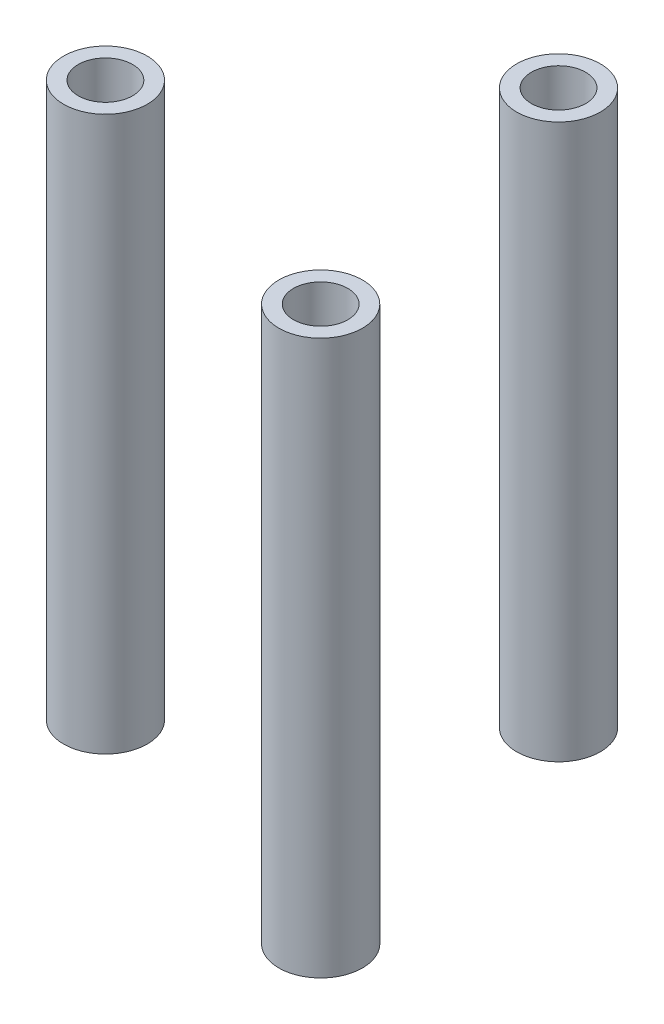
ISO-10303-21;
HEADER;
FILE_DESCRIPTION(('STEP AP214'),'2;1');
FILE_NAME('part.step','',(''),(''),'','','');
FILE_SCHEMA(('AUTOMOTIVE_DESIGN { 1 0 10303 214 1 1 1 1 }'));
ENDSEC;
DATA;
#1=APPLICATION_CONTEXT('core data for automotive mechanical design processes');
#2=APPLICATION_PROTOCOL_DEFINITION('international standard','automotive_design',2000,#1);
#3=PRODUCT_CONTEXT('',#1,'mechanical');
#4=PRODUCT('Part','Part','',(#3));
#5=PRODUCT_RELATED_PRODUCT_CATEGORY('part','',(#4));
#6=PRODUCT_DEFINITION_FORMATION('','',#4);
#7=PRODUCT_DEFINITION_CONTEXT('part definition',#1,'design');
#8=PRODUCT_DEFINITION('design','',#6,#7);
#9=PRODUCT_DEFINITION_SHAPE('','',#8);
#10=(LENGTH_UNIT() NAMED_UNIT(*) SI_UNIT(.MILLI.,.METRE.));
#11=(NAMED_UNIT(*) PLANE_ANGLE_UNIT() SI_UNIT($,.RADIAN.));
#12=(NAMED_UNIT(*) SI_UNIT($,.STERADIAN.) SOLID_ANGLE_UNIT());
#13=UNCERTAINTY_MEASURE_WITH_UNIT(LENGTH_MEASURE(1.E-05),#10,'distance_accuracy_value','');
#14=(GEOMETRIC_REPRESENTATION_CONTEXT(3) GLOBAL_UNCERTAINTY_ASSIGNED_CONTEXT((#13)) GLOBAL_UNIT_ASSIGNED_CONTEXT((#10,
#11,#12)) REPRESENTATION_CONTEXT('',''));
#15=CARTESIAN_POINT('',(0.,0.,0.));
#16=DIRECTION('',(0.,0.,1.));
#17=DIRECTION('',(1.,0.,0.));
#18=AXIS2_PLACEMENT_3D('',#15,#16,#17);
#19=CARTESIAN_POINT('',(5.43752160214528,53.,-16.5811899098407));
#20=DIRECTION('',(0.,-1.,0.));
#21=DIRECTION('',(0.,0.,-1.));
#22=AXIS2_PLACEMENT_3D('',#19,#20,#21);
#23=CYLINDRICAL_SURFACE('',#22,2.6);
#24=CARTESIAN_POINT('',(5.43752160214528,53.,-16.5811899098407));
#25=DIRECTION('',(0.,1.,0.));
#26=DIRECTION('',(0.,0.,1.));
#27=AXIS2_PLACEMENT_3D('',#24,#25,#26);
#28=CIRCLE('',#27,2.6);
#29=CARTESIAN_POINT('',(5.43752160214528,53.,-13.9811899098407));
#30=VERTEX_POINT('',#29);
#31=EDGE_CURVE('E53',#30,#30,#28,.T.);
#32=ORIENTED_EDGE('',*,*,#31,.T.);
#33=EDGE_LOOP('',(#32));
#34=FACE_BOUND('',#33,.T.);
#35=CARTESIAN_POINT('',(5.43752160214528,0.,-16.5811899098407));
#36=DIRECTION('',(0.,1.,0.));
#37=DIRECTION('',(0.,0.,1.));
#38=AXIS2_PLACEMENT_3D('',#35,#36,#37);
#39=CIRCLE('',#38,2.6);
#40=CARTESIAN_POINT('',(5.43752160214528,0.,-13.9811899098407));
#41=VERTEX_POINT('',#40);
#42=EDGE_CURVE('E59',#41,#41,#39,.T.);
#43=ORIENTED_EDGE('',*,*,#42,.F.);
#44=EDGE_LOOP('',(#43));
#45=FACE_BOUND('',#44,.T.);
#46=ADVANCED_FACE('F46',(#34,#45),#23,.F.);
#47=CARTESIAN_POINT('',(5.43752160214528,53.,-16.5811899098407));
#48=DIRECTION('',(0.,-1.,0.));
#49=DIRECTION('',(0.,0.,-1.));
#50=AXIS2_PLACEMENT_3D('',#47,#48,#49);
#51=CYLINDRICAL_SURFACE('',#50,4.);
#52=CARTESIAN_POINT('',(5.43752160214528,53.,-16.5811899098407));
#53=DIRECTION('',(0.,1.,0.));
#54=DIRECTION('',(0.,0.,1.));
#55=AXIS2_PLACEMENT_3D('',#52,#53,#54);
#56=CIRCLE('',#55,4.);
#57=CARTESIAN_POINT('',(5.43752160214528,53.,-12.5811899098407));
#58=VERTEX_POINT('',#57);
#59=EDGE_CURVE('E11',#58,#58,#56,.T.);
#60=ORIENTED_EDGE('',*,*,#59,.F.);
#61=EDGE_LOOP('',(#60));
#62=FACE_BOUND('',#61,.T.);
#63=CARTESIAN_POINT('',(5.43752160214528,0.,-16.5811899098407));
#64=DIRECTION('',(0.,1.,0.));
#65=DIRECTION('',(0.,0.,1.));
#66=AXIS2_PLACEMENT_3D('',#63,#64,#65);
#67=CIRCLE('',#66,4.);
#68=CARTESIAN_POINT('',(5.43752160214528,0.,-12.5811899098407));
#69=VERTEX_POINT('',#68);
#70=EDGE_CURVE('E49',#69,#69,#67,.T.);
#71=ORIENTED_EDGE('',*,*,#70,.T.);
#72=EDGE_LOOP('',(#71));
#73=FACE_BOUND('',#72,.T.);
#74=ADVANCED_FACE('F66',(#62,#73),#51,.T.);
#75=CARTESIAN_POINT('',(0.,53.,0.));
#76=DIRECTION('',(0.,1.,0.));
#77=DIRECTION('',(0.,0.,1.));
#78=AXIS2_PLACEMENT_3D('',#75,#76,#77);
#79=PLANE('',#78);
#80=ORIENTED_EDGE('',*,*,#31,.F.);
#81=EDGE_LOOP('',(#80));
#82=FACE_BOUND('',#81,.T.);
#83=ORIENTED_EDGE('',*,*,#59,.T.);
#84=EDGE_LOOP('',(#83));
#85=FACE_BOUND('',#84,.T.);
#86=ADVANCED_FACE('F70',(#82,#85),#79,.T.);
#87=CARTESIAN_POINT('',(0.,0.,0.));
#88=DIRECTION('',(0.,1.,0.));
#89=DIRECTION('',(0.,0.,1.));
#90=AXIS2_PLACEMENT_3D('',#87,#88,#89);
#91=PLANE('',#90);
#92=ORIENTED_EDGE('',*,*,#42,.T.);
#93=EDGE_LOOP('',(#92));
#94=FACE_BOUND('',#93,.T.);
#95=ORIENTED_EDGE('',*,*,#70,.F.);
#96=EDGE_LOOP('',(#95));
#97=FACE_BOUND('',#96,.T.);
#98=ADVANCED_FACE('F68',(#94,#97),#91,.F.);
#99=CLOSED_SHELL('',(#46,#74,#86,#98));
#100=MANIFOLD_SOLID_BREP('B2',#99);
#101=CARTESIAN_POINT('',(11.9677130017926,53.,12.6994624101465));
#102=DIRECTION('',(0.,-1.,0.));
#103=DIRECTION('',(0.,0.,-1.));
#104=AXIS2_PLACEMENT_3D('',#101,#102,#103);
#105=CYLINDRICAL_SURFACE('',#104,4.);
#106=CARTESIAN_POINT('',(11.9677130017926,53.,12.6994624101465));
#107=DIRECTION('',(0.,1.,0.));
#108=DIRECTION('',(0.,0.,1.));
#109=AXIS2_PLACEMENT_3D('',#106,#107,#108);
#110=CIRCLE('',#109,4.);
#111=CARTESIAN_POINT('',(11.9677130017926,53.,16.6994624101465));
#112=VERTEX_POINT('',#111);
#113=EDGE_CURVE('E129',#112,#112,#110,.T.);
#114=ORIENTED_EDGE('',*,*,#113,.F.);
#115=EDGE_LOOP('',(#114));
#116=FACE_BOUND('',#115,.T.);
#117=CARTESIAN_POINT('',(11.9677130017926,0.,12.6994624101465));
#118=DIRECTION('',(0.,1.,0.));
#119=DIRECTION('',(0.,0.,1.));
#120=AXIS2_PLACEMENT_3D('',#117,#118,#119);
#121=CIRCLE('',#120,4.);
#122=CARTESIAN_POINT('',(11.9677130017926,0.,16.6994624101465));
#123=VERTEX_POINT('',#122);
#124=EDGE_CURVE('E136',#123,#123,#121,.T.);
#125=ORIENTED_EDGE('',*,*,#124,.T.);
#126=EDGE_LOOP('',(#125));
#127=FACE_BOUND('',#126,.T.);
#128=ADVANCED_FACE('F121',(#116,#127),#105,.T.);
#129=CARTESIAN_POINT('',(11.9677130017926,53.,12.6994624101465));
#130=DIRECTION('',(0.,-1.,0.));
#131=DIRECTION('',(0.,0.,-1.));
#132=AXIS2_PLACEMENT_3D('',#129,#130,#131);
#133=CYLINDRICAL_SURFACE('',#132,2.6);
#134=CARTESIAN_POINT('',(11.9677130017926,53.,12.6994624101465));
#135=DIRECTION('',(0.,1.,0.));
#136=DIRECTION('',(0.,0.,1.));
#137=AXIS2_PLACEMENT_3D('',#134,#135,#136);
#138=CIRCLE('',#137,2.6);
#139=CARTESIAN_POINT('',(11.9677130017926,53.,15.2994624101465));
#140=VERTEX_POINT('',#139);
#141=EDGE_CURVE('E45',#140,#140,#138,.T.);
#142=ORIENTED_EDGE('',*,*,#141,.T.);
#143=EDGE_LOOP('',(#142));
#144=FACE_BOUND('',#143,.T.);
#145=CARTESIAN_POINT('',(11.9677130017926,0.,12.6994624101465));
#146=DIRECTION('',(0.,1.,0.));
#147=DIRECTION('',(0.,0.,1.));
#148=AXIS2_PLACEMENT_3D('',#145,#146,#147);
#149=CIRCLE('',#148,2.6);
#150=CARTESIAN_POINT('',(11.9677130017926,0.,15.2994624101465));
#151=VERTEX_POINT('',#150);
#152=EDGE_CURVE('E124',#151,#151,#149,.T.);
#153=ORIENTED_EDGE('',*,*,#152,.F.);
#154=EDGE_LOOP('',(#153));
#155=FACE_BOUND('',#154,.T.);
#156=ADVANCED_FACE('F147',(#144,#155),#133,.F.);
#157=CARTESIAN_POINT('',(0.,53.,0.));
#158=DIRECTION('',(0.,1.,0.));
#159=DIRECTION('',(0.,0.,1.));
#160=AXIS2_PLACEMENT_3D('',#157,#158,#159);
#161=PLANE('',#160);
#162=ORIENTED_EDGE('',*,*,#113,.T.);
#163=EDGE_LOOP('',(#162));
#164=FACE_BOUND('',#163,.T.);
#165=ORIENTED_EDGE('',*,*,#141,.F.);
#166=EDGE_LOOP('',(#165));
#167=FACE_BOUND('',#166,.T.);
#168=ADVANCED_FACE('F149',(#164,#167),#161,.T.);
#169=CARTESIAN_POINT('',(0.,0.,0.));
#170=DIRECTION('',(0.,1.,0.));
#171=DIRECTION('',(0.,0.,1.));
#172=AXIS2_PLACEMENT_3D('',#169,#170,#171);
#173=PLANE('',#172);
#174=ORIENTED_EDGE('',*,*,#124,.F.);
#175=EDGE_LOOP('',(#174));
#176=FACE_BOUND('',#175,.T.);
#177=ORIENTED_EDGE('',*,*,#152,.T.);
#178=EDGE_LOOP('',(#177));
#179=FACE_BOUND('',#178,.T.);
#180=ADVANCED_FACE('F145',(#176,#179),#173,.F.);
#181=CLOSED_SHELL('',(#128,#156,#168,#180));
#182=MANIFOLD_SOLID_BREP('B6',#181);
#183=CARTESIAN_POINT('',(-16.8743559301283,53.,4.44506602238306));
#184=DIRECTION('',(0.,-1.,0.));
#185=DIRECTION('',(0.,0.,-1.));
#186=AXIS2_PLACEMENT_3D('',#183,#184,#185);
#187=CYLINDRICAL_SURFACE('',#186,2.6);
#188=CARTESIAN_POINT('',(-16.8743559301283,53.,4.44506602238306));
#189=DIRECTION('',(0.,1.,0.));
#190=DIRECTION('',(0.,0.,1.));
#191=AXIS2_PLACEMENT_3D('',#188,#189,#190);
#192=CIRCLE('',#191,2.6);
#193=CARTESIAN_POINT('',(-16.8743559301283,53.,7.04506602238306));
#194=VERTEX_POINT('',#193);
#195=EDGE_CURVE('E200',#194,#194,#192,.T.);
#196=ORIENTED_EDGE('',*,*,#195,.T.);
#197=EDGE_LOOP('',(#196));
#198=FACE_BOUND('',#197,.T.);
#199=CARTESIAN_POINT('',(-16.8743559301283,0.,4.44506602238306));
#200=DIRECTION('',(0.,1.,0.));
#201=DIRECTION('',(0.,0.,1.));
#202=AXIS2_PLACEMENT_3D('',#199,#200,#201);
#203=CIRCLE('',#202,2.6);
#204=CARTESIAN_POINT('',(-16.8743559301283,0.,7.04506602238306));
#205=VERTEX_POINT('',#204);
#206=EDGE_CURVE('E206',#205,#205,#203,.T.);
#207=ORIENTED_EDGE('',*,*,#206,.F.);
#208=EDGE_LOOP('',(#207));
#209=FACE_BOUND('',#208,.T.);
#210=ADVANCED_FACE('F193',(#198,#209),#187,.F.);
#211=CARTESIAN_POINT('',(-16.8743559301283,53.,4.44506602238306));
#212=DIRECTION('',(0.,-1.,0.));
#213=DIRECTION('',(0.,0.,-1.));
#214=AXIS2_PLACEMENT_3D('',#211,#212,#213);
#215=CYLINDRICAL_SURFACE('',#214,4.);
#216=CARTESIAN_POINT('',(-16.8743559301283,53.,4.44506602238306));
#217=DIRECTION('',(0.,1.,0.));
#218=DIRECTION('',(0.,0.,1.));
#219=AXIS2_PLACEMENT_3D('',#216,#217,#218);
#220=CIRCLE('',#219,4.);
#221=CARTESIAN_POINT('',(-16.8743559301283,53.,8.44506602238306));
#222=VERTEX_POINT('',#221);
#223=EDGE_CURVE('E120',#222,#222,#220,.T.);
#224=ORIENTED_EDGE('',*,*,#223,.F.);
#225=EDGE_LOOP('',(#224));
#226=FACE_BOUND('',#225,.T.);
#227=CARTESIAN_POINT('',(-16.8743559301283,0.,4.44506602238306));
#228=DIRECTION('',(0.,1.,0.));
#229=DIRECTION('',(0.,0.,1.));
#230=AXIS2_PLACEMENT_3D('',#227,#228,#229);
#231=CIRCLE('',#230,4.);
#232=CARTESIAN_POINT('',(-16.8743559301283,0.,8.44506602238306));
#233=VERTEX_POINT('',#232);
#234=EDGE_CURVE('E196',#233,#233,#231,.T.);
#235=ORIENTED_EDGE('',*,*,#234,.T.);
#236=EDGE_LOOP('',(#235));
#237=FACE_BOUND('',#236,.T.);
#238=ADVANCED_FACE('F213',(#226,#237),#215,.T.);
#239=CARTESIAN_POINT('',(0.,53.,0.));
#240=DIRECTION('',(0.,1.,0.));
#241=DIRECTION('',(0.,0.,1.));
#242=AXIS2_PLACEMENT_3D('',#239,#240,#241);
#243=PLANE('',#242);
#244=ORIENTED_EDGE('',*,*,#195,.F.);
#245=EDGE_LOOP('',(#244));
#246=FACE_BOUND('',#245,.T.);
#247=ORIENTED_EDGE('',*,*,#223,.T.);
#248=EDGE_LOOP('',(#247));
#249=FACE_BOUND('',#248,.T.);
#250=ADVANCED_FACE('F217',(#246,#249),#243,.T.);
#251=CARTESIAN_POINT('',(0.,0.,0.));
#252=DIRECTION('',(0.,1.,0.));
#253=DIRECTION('',(0.,0.,1.));
#254=AXIS2_PLACEMENT_3D('',#251,#252,#253);
#255=PLANE('',#254);
#256=ORIENTED_EDGE('',*,*,#206,.T.);
#257=EDGE_LOOP('',(#256));
#258=FACE_BOUND('',#257,.T.);
#259=ORIENTED_EDGE('',*,*,#234,.F.);
#260=EDGE_LOOP('',(#259));
#261=FACE_BOUND('',#260,.T.);
#262=ADVANCED_FACE('F215',(#258,#261),#255,.F.);
#263=CLOSED_SHELL('',(#210,#238,#250,#262));
#264=MANIFOLD_SOLID_BREP('B40',#263);
#265=ADVANCED_BREP_SHAPE_REPRESENTATION('',(#18,#100,#182,#264),#14);
#266=SHAPE_DEFINITION_REPRESENTATION(#9,#265);
ENDSEC;
END-ISO-10303-21;
